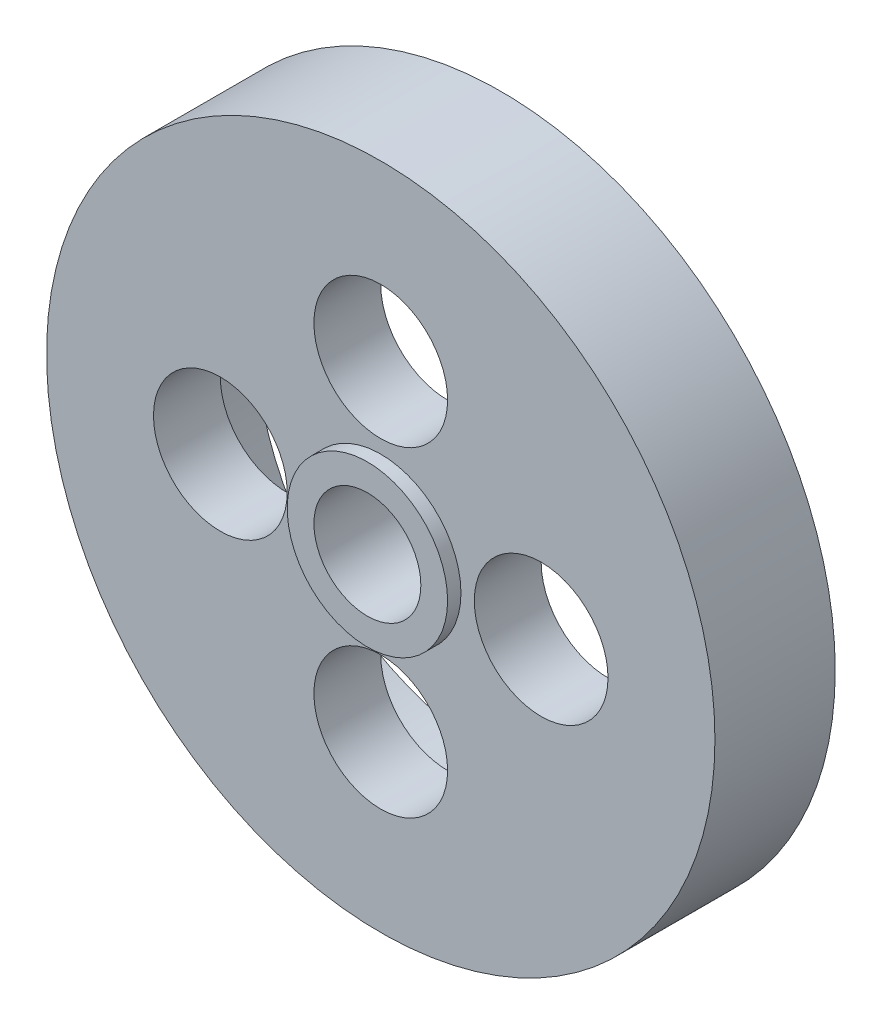
ISO-10303-21;
HEADER;
FILE_DESCRIPTION(('STEP AP214'),'2;1');
FILE_NAME('part.step','',(''),(''),'','','');
FILE_SCHEMA(('AUTOMOTIVE_DESIGN { 1 0 10303 214 1 1 1 1 }'));
ENDSEC;
DATA;
#1=APPLICATION_CONTEXT('core data for automotive mechanical design processes');
#2=APPLICATION_PROTOCOL_DEFINITION('international standard','automotive_design',2000,#1);
#3=PRODUCT_CONTEXT('',#1,'mechanical');
#4=PRODUCT('Part','Part','',(#3));
#5=PRODUCT_RELATED_PRODUCT_CATEGORY('part','',(#4));
#6=PRODUCT_DEFINITION_FORMATION('','',#4);
#7=PRODUCT_DEFINITION_CONTEXT('part definition',#1,'design');
#8=PRODUCT_DEFINITION('design','',#6,#7);
#9=PRODUCT_DEFINITION_SHAPE('','',#8);
#10=(LENGTH_UNIT() NAMED_UNIT(*) SI_UNIT(.MILLI.,.METRE.));
#11=(NAMED_UNIT(*) PLANE_ANGLE_UNIT() SI_UNIT($,.RADIAN.));
#12=(NAMED_UNIT(*) SI_UNIT($,.STERADIAN.) SOLID_ANGLE_UNIT());
#13=UNCERTAINTY_MEASURE_WITH_UNIT(LENGTH_MEASURE(1.E-05),#10,'distance_accuracy_value','');
#14=(GEOMETRIC_REPRESENTATION_CONTEXT(3) GLOBAL_UNCERTAINTY_ASSIGNED_CONTEXT((#13)) GLOBAL_UNIT_ASSIGNED_CONTEXT((#10,
#11,#12)) REPRESENTATION_CONTEXT('',''));
#15=CARTESIAN_POINT('',(0.,0.,0.));
#16=DIRECTION('',(0.,0.,1.));
#17=DIRECTION('',(1.,0.,0.));
#18=AXIS2_PLACEMENT_3D('',#15,#16,#17);
#19=CARTESIAN_POINT('',(0.,0.,3.43172730560581));
#20=DIRECTION('',(0.,0.,-1.));
#21=DIRECTION('',(-1.,0.,0.));
#22=AXIS2_PLACEMENT_3D('',#19,#20,#21);
#23=CYLINDRICAL_SURFACE('',#22,27.);
#24=CARTESIAN_POINT('',(0.,0.,3.43172730560581));
#25=DIRECTION('',(0.,0.,-1.));
#26=DIRECTION('',(-1.,0.,0.));
#27=AXIS2_PLACEMENT_3D('',#24,#25,#26);
#28=CIRCLE('',#27,27.);
#29=CARTESIAN_POINT('',(-27.,0.,3.43172730560581));
#30=VERTEX_POINT('',#29);
#31=EDGE_CURVE('E52',#30,#30,#28,.T.);
#32=ORIENTED_EDGE('',*,*,#31,.F.);
#33=EDGE_LOOP('',(#32));
#34=FACE_BOUND('',#33,.T.);
#35=CARTESIAN_POINT('',(0.,0.,-2.10983279385489));
#36=DIRECTION('',(0.,0.,-1.));
#37=DIRECTION('',(-1.,0.,0.));
#38=AXIS2_PLACEMENT_3D('',#35,#36,#37);
#39=CIRCLE('',#38,27.);
#40=CARTESIAN_POINT('',(-27.,0.,-2.10983279385489));
#41=VERTEX_POINT('',#40);
#42=EDGE_CURVE('E37',#41,#41,#39,.F.);
#43=ORIENTED_EDGE('',*,*,#42,.F.);
#44=EDGE_LOOP('',(#43));
#45=FACE_BOUND('',#44,.T.);
#46=ADVANCED_FACE('F33',(#34,#45),#23,.F.);
#47=CARTESIAN_POINT('',(0.,0.,10.9317273056058));
#48=DIRECTION('',(0.,0.,1.));
#49=DIRECTION('',(1.,0.,0.));
#50=AXIS2_PLACEMENT_3D('',#47,#48,#49);
#51=PLANE('',#50);
#52=CARTESIAN_POINT('',(-18.,0.,10.9317273056058));
#53=DIRECTION('',(0.,0.,1.));
#54=DIRECTION('',(1.,0.,0.));
#55=AXIS2_PLACEMENT_3D('',#52,#53,#54);
#56=CIRCLE('',#55,7.50000000000019);
#57=CARTESIAN_POINT('',(-10.4999999999998,0.,10.9317273056058));
#58=VERTEX_POINT('',#57);
#59=EDGE_CURVE('E76',#58,#58,#56,.T.);
#60=ORIENTED_EDGE('',*,*,#59,.F.);
#61=EDGE_LOOP('',(#60));
#62=FACE_BOUND('',#61,.T.);
#63=CARTESIAN_POINT('',(18.,0.,10.9317273056058));
#64=DIRECTION('',(0.,0.,1.));
#65=DIRECTION('',(1.,0.,0.));
#66=AXIS2_PLACEMENT_3D('',#63,#64,#65);
#67=CIRCLE('',#66,7.5);
#68=CARTESIAN_POINT('',(25.5,0.,10.9317273056058));
#69=VERTEX_POINT('',#68);
#70=EDGE_CURVE('E46',#69,#69,#67,.T.);
#71=ORIENTED_EDGE('',*,*,#70,.F.);
#72=EDGE_LOOP('',(#71));
#73=FACE_BOUND('',#72,.T.);
#74=CARTESIAN_POINT('',(0.,18.,10.9317273056058));
#75=DIRECTION('',(0.,0.,1.));
#76=DIRECTION('',(1.,0.,0.));
#77=AXIS2_PLACEMENT_3D('',#74,#75,#76);
#78=CIRCLE('',#77,7.5);
#79=CARTESIAN_POINT('',(7.49999999999999,18.,10.9317273056058));
#80=VERTEX_POINT('',#79);
#81=EDGE_CURVE('E41',#80,#80,#78,.T.);
#82=ORIENTED_EDGE('',*,*,#81,.F.);
#83=EDGE_LOOP('',(#82));
#84=FACE_BOUND('',#83,.T.);
#85=CARTESIAN_POINT('',(0.,0.,10.9317273056058));
#86=DIRECTION('',(0.,0.,1.));
#87=DIRECTION('',(1.,0.,0.));
#88=AXIS2_PLACEMENT_3D('',#85,#86,#87);
#89=CIRCLE('',#88,37.5);
#90=CARTESIAN_POINT('',(37.5,0.,10.9317273056058));
#91=VERTEX_POINT('',#90);
#92=EDGE_CURVE('E10',#91,#91,#89,.T.);
#93=ORIENTED_EDGE('',*,*,#92,.T.);
#94=EDGE_LOOP('',(#93));
#95=FACE_BOUND('',#94,.T.);
#96=CARTESIAN_POINT('',(0.,-18.,10.9317273056058));
#97=DIRECTION('',(0.,0.,1.));
#98=DIRECTION('',(1.,0.,0.));
#99=AXIS2_PLACEMENT_3D('',#96,#97,#98);
#100=CIRCLE('',#99,7.50000000000012);
#101=CARTESIAN_POINT('',(7.50000000000012,-18.,10.9317273056058));
#102=VERTEX_POINT('',#101);
#103=EDGE_CURVE('E79',#102,#102,#100,.T.);
#104=ORIENTED_EDGE('',*,*,#103,.F.);
#105=EDGE_LOOP('',(#104));
#106=FACE_BOUND('',#105,.T.);
#107=CARTESIAN_POINT('',(0.,0.,10.9317273056058));
#108=DIRECTION('',(0.,0.,1.));
#109=DIRECTION('',(1.,0.,0.));
#110=AXIS2_PLACEMENT_3D('',#107,#108,#109);
#111=CIRCLE('',#110,9.);
#112=CARTESIAN_POINT('',(8.99999999999999,0.,10.9317273056058));
#113=VERTEX_POINT('',#112);
#114=EDGE_CURVE('E64',#113,#113,#111,.T.);
#115=ORIENTED_EDGE('',*,*,#114,.F.);
#116=EDGE_LOOP('',(#115));
#117=FACE_BOUND('',#116,.T.);
#118=ADVANCED_FACE('F87',(#62,#73,#84,#95,#106,#117),#51,.T.);
#119=CARTESIAN_POINT('',(0.,18.,10.9317273056058));
#120=DIRECTION('',(0.,0.,-1.));
#121=DIRECTION('',(-1.,0.,0.));
#122=AXIS2_PLACEMENT_3D('',#119,#120,#121);
#123=CYLINDRICAL_SURFACE('',#122,7.5);
#124=ORIENTED_EDGE('',*,*,#81,.T.);
#125=EDGE_LOOP('',(#124));
#126=FACE_BOUND('',#125,.T.);
#127=CARTESIAN_POINT('',(0.,18.,3.43172730560581));
#128=DIRECTION('',(0.,0.,-1.));
#129=DIRECTION('',(-1.,0.,0.));
#130=AXIS2_PLACEMENT_3D('',#127,#128,#129);
#131=CIRCLE('',#130,7.5);
#132=CARTESIAN_POINT('',(-7.50000000000001,18.,3.43172730560581));
#133=VERTEX_POINT('',#132);
#134=EDGE_CURVE('E73',#133,#133,#131,.T.);
#135=ORIENTED_EDGE('',*,*,#134,.T.);
#136=EDGE_LOOP('',(#135));
#137=FACE_BOUND('',#136,.T.);
#138=ADVANCED_FACE('F90',(#126,#137),#123,.F.);
#139=CARTESIAN_POINT('',(0.,0.,10.9317273056058));
#140=DIRECTION('',(0.,0.,-1.));
#141=DIRECTION('',(-1.,0.,0.));
#142=AXIS2_PLACEMENT_3D('',#139,#140,#141);
#143=CYLINDRICAL_SURFACE('',#142,6.);
#144=CARTESIAN_POINT('',(0.,0.,3.43172730560581));
#145=DIRECTION('',(0.,0.,-1.));
#146=DIRECTION('',(-1.,0.,0.));
#147=AXIS2_PLACEMENT_3D('',#144,#145,#146);
#148=CIRCLE('',#147,6.);
#149=CARTESIAN_POINT('',(-6.00000000000001,0.,3.43172730560581));
#150=VERTEX_POINT('',#149);
#151=EDGE_CURVE('E70',#150,#150,#148,.T.);
#152=ORIENTED_EDGE('',*,*,#151,.T.);
#153=EDGE_LOOP('',(#152));
#154=FACE_BOUND('',#153,.T.);
#155=CARTESIAN_POINT('',(0.,0.,12.4317273056058));
#156=DIRECTION('',(0.,0.,1.));
#157=DIRECTION('',(1.,0.,0.));
#158=AXIS2_PLACEMENT_3D('',#155,#156,#157);
#159=CIRCLE('',#158,6.);
#160=CARTESIAN_POINT('',(5.99999999999999,0.,12.4317273056058));
#161=VERTEX_POINT('',#160);
#162=EDGE_CURVE('E99',#161,#161,#159,.T.);
#163=ORIENTED_EDGE('',*,*,#162,.T.);
#164=EDGE_LOOP('',(#163));
#165=FACE_BOUND('',#164,.T.);
#166=ADVANCED_FACE('F137',(#154,#165),#143,.F.);
#167=CARTESIAN_POINT('',(18.,0.,10.9317273056058));
#168=DIRECTION('',(0.,0.,-1.));
#169=DIRECTION('',(-1.,0.,0.));
#170=AXIS2_PLACEMENT_3D('',#167,#168,#169);
#171=CYLINDRICAL_SURFACE('',#170,7.5);
#172=ORIENTED_EDGE('',*,*,#70,.T.);
#173=EDGE_LOOP('',(#172));
#174=FACE_BOUND('',#173,.T.);
#175=CARTESIAN_POINT('',(18.,0.,3.43172730560581));
#176=DIRECTION('',(0.,0.,-1.));
#177=DIRECTION('',(-1.,0.,0.));
#178=AXIS2_PLACEMENT_3D('',#175,#176,#177);
#179=CIRCLE('',#178,7.5);
#180=CARTESIAN_POINT('',(10.5,0.,3.43172730560581));
#181=VERTEX_POINT('',#180);
#182=EDGE_CURVE('E56',#181,#181,#179,.T.);
#183=ORIENTED_EDGE('',*,*,#182,.T.);
#184=EDGE_LOOP('',(#183));
#185=FACE_BOUND('',#184,.T.);
#186=ADVANCED_FACE('F84',(#174,#185),#171,.F.);
#187=CARTESIAN_POINT('',(0.,-18.,10.9317273056058));
#188=DIRECTION('',(0.,0.,-1.));
#189=DIRECTION('',(-1.,0.,0.));
#190=AXIS2_PLACEMENT_3D('',#187,#188,#189);
#191=CYLINDRICAL_SURFACE('',#190,7.50000000000012);
#192=ORIENTED_EDGE('',*,*,#103,.T.);
#193=EDGE_LOOP('',(#192));
#194=FACE_BOUND('',#193,.T.);
#195=CARTESIAN_POINT('',(0.,-18.,3.43172730560581));
#196=DIRECTION('',(0.,0.,-1.));
#197=DIRECTION('',(-1.,0.,0.));
#198=AXIS2_PLACEMENT_3D('',#195,#196,#197);
#199=CIRCLE('',#198,7.50000000000012);
#200=CARTESIAN_POINT('',(-7.50000000000013,-18.,3.43172730560581));
#201=VERTEX_POINT('',#200);
#202=EDGE_CURVE('E51',#201,#201,#199,.T.);
#203=ORIENTED_EDGE('',*,*,#202,.T.);
#204=EDGE_LOOP('',(#203));
#205=FACE_BOUND('',#204,.T.);
#206=ADVANCED_FACE('F130',(#194,#205),#191,.F.);
#207=CARTESIAN_POINT('',(-18.,0.,10.9317273056058));
#208=DIRECTION('',(0.,0.,-1.));
#209=DIRECTION('',(-1.,0.,0.));
#210=AXIS2_PLACEMENT_3D('',#207,#208,#209);
#211=CYLINDRICAL_SURFACE('',#210,7.50000000000019);
#212=ORIENTED_EDGE('',*,*,#59,.T.);
#213=EDGE_LOOP('',(#212));
#214=FACE_BOUND('',#213,.T.);
#215=CARTESIAN_POINT('',(-18.,0.,3.43172730560581));
#216=DIRECTION('',(0.,0.,-1.));
#217=DIRECTION('',(-1.,0.,0.));
#218=AXIS2_PLACEMENT_3D('',#215,#216,#217);
#219=CIRCLE('',#218,7.50000000000019);
#220=CARTESIAN_POINT('',(-25.5000000000002,0.,3.43172730560581));
#221=VERTEX_POINT('',#220);
#222=EDGE_CURVE('E49',#221,#221,#219,.T.);
#223=ORIENTED_EDGE('',*,*,#222,.T.);
#224=EDGE_LOOP('',(#223));
#225=FACE_BOUND('',#224,.T.);
#226=ADVANCED_FACE('F127',(#214,#225),#211,.F.);
#227=CARTESIAN_POINT('',(0.,0.,10.9317273056058));
#228=DIRECTION('',(0.,0.,-1.));
#229=DIRECTION('',(-1.,0.,0.));
#230=AXIS2_PLACEMENT_3D('',#227,#228,#229);
#231=CYLINDRICAL_SURFACE('',#230,37.5);
#232=ORIENTED_EDGE('',*,*,#92,.F.);
#233=EDGE_LOOP('',(#232));
#234=FACE_BOUND('',#233,.T.);
#235=CARTESIAN_POINT('',(0.,0.,-2.56827269439419));
#236=DIRECTION('',(0.,0.,1.));
#237=DIRECTION('',(1.,0.,0.));
#238=AXIS2_PLACEMENT_3D('',#235,#236,#237);
#239=CIRCLE('',#238,37.5);
#240=CARTESIAN_POINT('',(37.5,0.,-2.56827269439419));
#241=VERTEX_POINT('',#240);
#242=EDGE_CURVE('E105',#241,#241,#239,.T.);
#243=ORIENTED_EDGE('',*,*,#242,.T.);
#244=EDGE_LOOP('',(#243));
#245=FACE_BOUND('',#244,.T.);
#246=ADVANCED_FACE('F35',(#234,#245),#231,.T.);
#247=CARTESIAN_POINT('',(0.,0.,3.43172730560581));
#248=DIRECTION('',(0.,0.,-1.));
#249=DIRECTION('',(-1.,0.,0.));
#250=AXIS2_PLACEMENT_3D('',#247,#248,#249);
#251=PLANE('',#250);
#252=ORIENTED_EDGE('',*,*,#134,.F.);
#253=EDGE_LOOP('',(#252));
#254=FACE_BOUND('',#253,.T.);
#255=ORIENTED_EDGE('',*,*,#151,.F.);
#256=EDGE_LOOP('',(#255));
#257=FACE_BOUND('',#256,.T.);
#258=ORIENTED_EDGE('',*,*,#182,.F.);
#259=EDGE_LOOP('',(#258));
#260=FACE_BOUND('',#259,.T.);
#261=ORIENTED_EDGE('',*,*,#202,.F.);
#262=EDGE_LOOP('',(#261));
#263=FACE_BOUND('',#262,.T.);
#264=ORIENTED_EDGE('',*,*,#222,.F.);
#265=EDGE_LOOP('',(#264));
#266=FACE_BOUND('',#265,.T.);
#267=ORIENTED_EDGE('',*,*,#31,.T.);
#268=EDGE_LOOP('',(#267));
#269=FACE_BOUND('',#268,.T.);
#270=ADVANCED_FACE('F125',(#254,#257,#260,#263,#266,#269),#251,.T.);
#271=CARTESIAN_POINT('',(0.,0.,12.4317273056058));
#272=DIRECTION('',(0.,0.,1.));
#273=DIRECTION('',(1.,0.,0.));
#274=AXIS2_PLACEMENT_3D('',#271,#272,#273);
#275=PLANE('',#274);
#276=CARTESIAN_POINT('',(0.,0.,12.4317273056058));
#277=DIRECTION('',(0.,0.,1.));
#278=DIRECTION('',(1.,0.,0.));
#279=AXIS2_PLACEMENT_3D('',#276,#277,#278);
#280=CIRCLE('',#279,9.);
#281=CARTESIAN_POINT('',(8.99999999999999,0.,12.4317273056058));
#282=VERTEX_POINT('',#281);
#283=EDGE_CURVE('E59',#282,#282,#280,.T.);
#284=ORIENTED_EDGE('',*,*,#283,.T.);
#285=EDGE_LOOP('',(#284));
#286=FACE_BOUND('',#285,.T.);
#287=ORIENTED_EDGE('',*,*,#162,.F.);
#288=EDGE_LOOP('',(#287));
#289=FACE_BOUND('',#288,.T.);
#290=ADVANCED_FACE('F150',(#286,#289),#275,.T.);
#291=CARTESIAN_POINT('',(0.,0.,12.4317273056058));
#292=DIRECTION('',(0.,0.,-1.));
#293=DIRECTION('',(-1.,0.,0.));
#294=AXIS2_PLACEMENT_3D('',#291,#292,#293);
#295=CYLINDRICAL_SURFACE('',#294,9.);
#296=ORIENTED_EDGE('',*,*,#283,.F.);
#297=EDGE_LOOP('',(#296));
#298=FACE_BOUND('',#297,.T.);
#299=ORIENTED_EDGE('',*,*,#114,.T.);
#300=EDGE_LOOP('',(#299));
#301=FACE_BOUND('',#300,.T.);
#302=ADVANCED_FACE('F114',(#298,#301),#295,.T.);
#303=CARTESIAN_POINT('',(0.,0.,-2.56827269439419));
#304=DIRECTION('',(0.,0.,-1.));
#305=DIRECTION('',(-1.,0.,0.));
#306=AXIS2_PLACEMENT_3D('',#303,#304,#305);
#307=CONICAL_SURFACE('',#306,37.5,1.52716309549505);
#308=ORIENTED_EDGE('',*,*,#242,.F.);
#309=EDGE_LOOP('',(#308));
#310=FACE_BOUND('',#309,.T.);
#311=ORIENTED_EDGE('',*,*,#42,.T.);
#312=EDGE_LOOP('',(#311));
#313=FACE_BOUND('',#312,.T.);
#314=ADVANCED_FACE('F111',(#310,#313),#307,.F.);
#315=CLOSED_SHELL('',(#46,#118,#138,#166,#186,#206,#226,#246,#270,#290,#302,#314));
#316=MANIFOLD_SOLID_BREP('B2',#315);
#317=ADVANCED_BREP_SHAPE_REPRESENTATION('',(#18,#316),#14);
#318=SHAPE_DEFINITION_REPRESENTATION(#9,#317);
ENDSEC;
END-ISO-10303-21;
